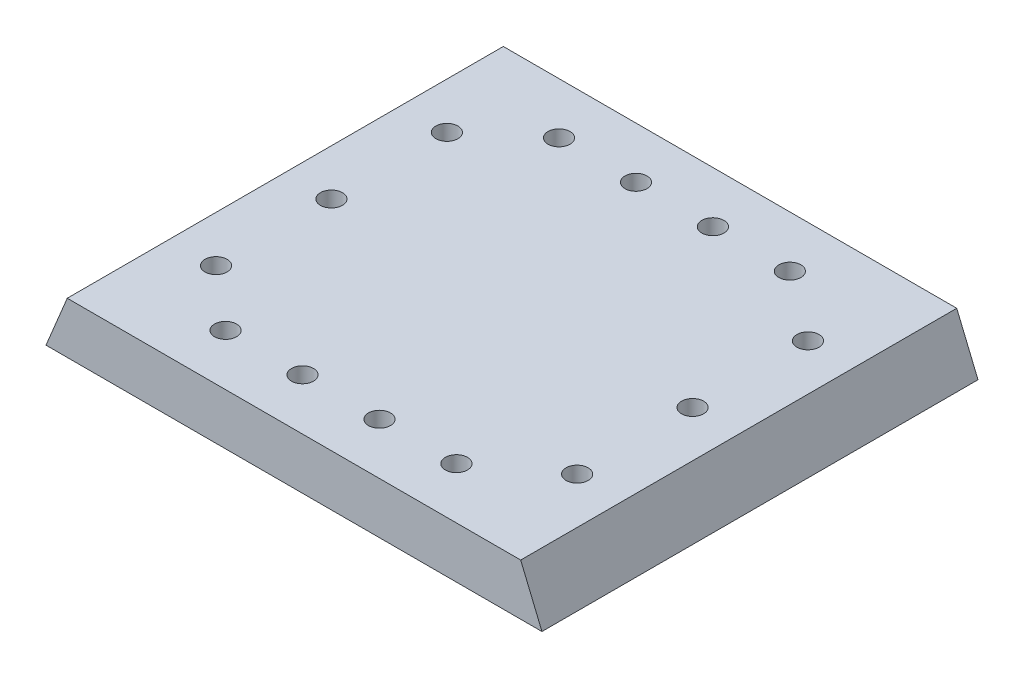
ISO-10303-21;
HEADER;
FILE_DESCRIPTION(('STEP AP214'),'2;1');
FILE_NAME('part.step','',(''),(''),'','','');
FILE_SCHEMA(('AUTOMOTIVE_DESIGN { 1 0 10303 214 1 1 1 1 }'));
ENDSEC;
DATA;
#1=APPLICATION_CONTEXT('core data for automotive mechanical design processes');
#2=APPLICATION_PROTOCOL_DEFINITION('international standard','automotive_design',2000,#1);
#3=PRODUCT_CONTEXT('',#1,'mechanical');
#4=PRODUCT('Part','Part','',(#3));
#5=PRODUCT_RELATED_PRODUCT_CATEGORY('part','',(#4));
#6=PRODUCT_DEFINITION_FORMATION('','',#4);
#7=PRODUCT_DEFINITION_CONTEXT('part definition',#1,'design');
#8=PRODUCT_DEFINITION('design','',#6,#7);
#9=PRODUCT_DEFINITION_SHAPE('','',#8);
#10=(LENGTH_UNIT() NAMED_UNIT(*) SI_UNIT(.MILLI.,.METRE.));
#11=(NAMED_UNIT(*) PLANE_ANGLE_UNIT() SI_UNIT($,.RADIAN.));
#12=(NAMED_UNIT(*) SI_UNIT($,.STERADIAN.) SOLID_ANGLE_UNIT());
#13=UNCERTAINTY_MEASURE_WITH_UNIT(LENGTH_MEASURE(1.E-05),#10,'distance_accuracy_value','');
#14=(GEOMETRIC_REPRESENTATION_CONTEXT(3) GLOBAL_UNCERTAINTY_ASSIGNED_CONTEXT((#13)) GLOBAL_UNIT_ASSIGNED_CONTEXT((#10,
#11,#12)) REPRESENTATION_CONTEXT('',''));
#15=CARTESIAN_POINT('',(0.,0.,0.));
#16=DIRECTION('',(0.,0.,1.));
#17=DIRECTION('',(1.,0.,0.));
#18=AXIS2_PLACEMENT_3D('',#15,#16,#17);
#19=CARTESIAN_POINT('',(70.,85.,9.99999999999999));
#20=DIRECTION('',(0.,-1.,0.));
#21=DIRECTION('',(0.,0.,-1.));
#22=AXIS2_PLACEMENT_3D('',#19,#20,#21);
#23=CYLINDRICAL_SURFACE('',#22,2.15);
#24=CARTESIAN_POINT('',(70.,0.,9.99999999999999));
#25=DIRECTION('',(0.,-1.,0.));
#26=DIRECTION('',(0.,0.,1.));
#27=AXIS2_PLACEMENT_3D('',#24,#25,#26);
#28=CIRCLE('',#27,2.15);
#29=CARTESIAN_POINT('',(70.,0.,12.15));
#30=VERTEX_POINT('',#29);
#31=EDGE_CURVE('E55',#30,#30,#28,.T.);
#32=ORIENTED_EDGE('',*,*,#31,.T.);
#33=EDGE_LOOP('',(#32));
#34=FACE_BOUND('',#33,.T.);
#35=CARTESIAN_POINT('',(70.,9.99999999999999,9.99999999999999));
#36=DIRECTION('',(0.,-1.,0.));
#37=DIRECTION('',(1.,0.,0.));
#38=AXIS2_PLACEMENT_3D('',#35,#36,#37);
#39=CIRCLE('',#38,2.15);
#40=CARTESIAN_POINT('',(72.15,9.99999999999999,9.99999999999999));
#41=VERTEX_POINT('',#40);
#42=EDGE_CURVE('E11',#41,#41,#39,.T.);
#43=ORIENTED_EDGE('',*,*,#42,.F.);
#44=EDGE_LOOP('',(#43));
#45=FACE_BOUND('',#44,.T.);
#46=ADVANCED_FACE('F46',(#34,#45),#23,.F.);
#47=CARTESIAN_POINT('',(55.,85.,9.99999999999999));
#48=DIRECTION('',(0.,-1.,0.));
#49=DIRECTION('',(0.,0.,-1.));
#50=AXIS2_PLACEMENT_3D('',#47,#48,#49);
#51=CYLINDRICAL_SURFACE('',#50,2.15);
#52=CARTESIAN_POINT('',(55.,0.,9.99999999999999));
#53=DIRECTION('',(0.,-1.,0.));
#54=DIRECTION('',(0.,0.,1.));
#55=AXIS2_PLACEMENT_3D('',#52,#53,#54);
#56=CIRCLE('',#55,2.15);
#57=CARTESIAN_POINT('',(55.,0.,12.15));
#58=VERTEX_POINT('',#57);
#59=EDGE_CURVE('E160',#58,#58,#56,.T.);
#60=ORIENTED_EDGE('',*,*,#59,.T.);
#61=EDGE_LOOP('',(#60));
#62=FACE_BOUND('',#61,.T.);
#63=CARTESIAN_POINT('',(55.,9.99999999999999,9.99999999999999));
#64=DIRECTION('',(0.,-1.,0.));
#65=DIRECTION('',(1.,0.,0.));
#66=AXIS2_PLACEMENT_3D('',#63,#64,#65);
#67=CIRCLE('',#66,2.15);
#68=CARTESIAN_POINT('',(57.15,9.99999999999999,9.99999999999999));
#69=VERTEX_POINT('',#68);
#70=EDGE_CURVE('E164',#69,#69,#67,.T.);
#71=ORIENTED_EDGE('',*,*,#70,.F.);
#72=EDGE_LOOP('',(#71));
#73=FACE_BOUND('',#72,.T.);
#74=ADVANCED_FACE('F191',(#62,#73),#51,.F.);
#75=CARTESIAN_POINT('',(70.,85.,75.));
#76=DIRECTION('',(0.,-1.,0.));
#77=DIRECTION('',(0.,0.,-1.));
#78=AXIS2_PLACEMENT_3D('',#75,#76,#77);
#79=CYLINDRICAL_SURFACE('',#78,2.15);
#80=CARTESIAN_POINT('',(70.,0.,75.));
#81=DIRECTION('',(0.,-1.,0.));
#82=DIRECTION('',(0.,0.,-1.));
#83=AXIS2_PLACEMENT_3D('',#80,#81,#82);
#84=CIRCLE('',#83,2.15);
#85=CARTESIAN_POINT('',(70.,0.,72.85));
#86=VERTEX_POINT('',#85);
#87=EDGE_CURVE('E152',#86,#86,#84,.T.);
#88=ORIENTED_EDGE('',*,*,#87,.T.);
#89=EDGE_LOOP('',(#88));
#90=FACE_BOUND('',#89,.T.);
#91=CARTESIAN_POINT('',(70.,9.99999999999999,75.));
#92=DIRECTION('',(0.,-1.,0.));
#93=DIRECTION('',(1.,0.,0.));
#94=AXIS2_PLACEMENT_3D('',#91,#92,#93);
#95=CIRCLE('',#94,2.15);
#96=CARTESIAN_POINT('',(72.15,9.99999999999999,75.));
#97=VERTEX_POINT('',#96);
#98=EDGE_CURVE('E156',#97,#97,#95,.T.);
#99=ORIENTED_EDGE('',*,*,#98,.F.);
#100=EDGE_LOOP('',(#99));
#101=FACE_BOUND('',#100,.T.);
#102=ADVANCED_FACE('F196',(#90,#101),#79,.F.);
#103=CARTESIAN_POINT('',(55.,85.,75.));
#104=DIRECTION('',(0.,-1.,0.));
#105=DIRECTION('',(0.,0.,-1.));
#106=AXIS2_PLACEMENT_3D('',#103,#104,#105);
#107=CYLINDRICAL_SURFACE('',#106,2.15);
#108=CARTESIAN_POINT('',(55.,0.,75.));
#109=DIRECTION('',(0.,-1.,0.));
#110=DIRECTION('',(0.,0.,-1.));
#111=AXIS2_PLACEMENT_3D('',#108,#109,#110);
#112=CIRCLE('',#111,2.15);
#113=CARTESIAN_POINT('',(55.,0.,72.85));
#114=VERTEX_POINT('',#113);
#115=EDGE_CURVE('E136',#114,#114,#112,.T.);
#116=ORIENTED_EDGE('',*,*,#115,.T.);
#117=EDGE_LOOP('',(#116));
#118=FACE_BOUND('',#117,.T.);
#119=CARTESIAN_POINT('',(55.,9.99999999999999,75.));
#120=DIRECTION('',(0.,-1.,0.));
#121=DIRECTION('',(1.,0.,0.));
#122=AXIS2_PLACEMENT_3D('',#119,#120,#121);
#123=CIRCLE('',#122,2.15);
#124=CARTESIAN_POINT('',(57.15,9.99999999999999,75.));
#125=VERTEX_POINT('',#124);
#126=EDGE_CURVE('E148',#125,#125,#123,.T.);
#127=ORIENTED_EDGE('',*,*,#126,.F.);
#128=EDGE_LOOP('',(#127));
#129=FACE_BOUND('',#128,.T.);
#130=ADVANCED_FACE('F185',(#118,#129),#107,.F.);
#131=CARTESIAN_POINT('',(4.14213562373091,9.99999999999999,85.));
#132=DIRECTION('',(0.923879532511288,-0.382683432365087,0.));
#133=DIRECTION('',(0.382683432365087,0.923879532511288,0.));
#134=AXIS2_PLACEMENT_3D('',#131,#132,#133);
#135=PLANE('',#134);
#136=DIRECTION('',(-0.382683432365087,-0.923879532511288,0.));
#137=VECTOR('',#136,1.);
#138=CARTESIAN_POINT('',(4.14213562373091,9.99999999999999,0.));
#139=LINE('',#138,#137);
#140=CARTESIAN_POINT('',(4.14213562373091,9.99999999999999,0.));
#141=VERTEX_POINT('',#140);
#142=CARTESIAN_POINT('',(0.,0.,0.));
#143=VERTEX_POINT('',#142);
#144=EDGE_CURVE('E119',#141,#143,#139,.T.);
#145=ORIENTED_EDGE('',*,*,#144,.T.);
#146=DIRECTION('',(0.,0.,-1.));
#147=VECTOR('',#146,1.);
#148=CARTESIAN_POINT('',(0.,0.,85.));
#149=LINE('',#148,#147);
#150=CARTESIAN_POINT('',(0.,0.,85.));
#151=VERTEX_POINT('',#150);
#152=EDGE_CURVE('E108',#151,#143,#149,.T.);
#153=ORIENTED_EDGE('',*,*,#152,.F.);
#154=DIRECTION('',(-0.382683432365087,-0.923879532511288,0.));
#155=VECTOR('',#154,1.);
#156=CARTESIAN_POINT('',(4.14213562373091,9.99999999999999,85.));
#157=LINE('',#156,#155);
#158=CARTESIAN_POINT('',(4.14213562373091,9.99999999999999,85.));
#159=VERTEX_POINT('',#158);
#160=EDGE_CURVE('E99',#159,#151,#157,.T.);
#161=ORIENTED_EDGE('',*,*,#160,.F.);
#162=DIRECTION('',(0.,0.,-1.));
#163=VECTOR('',#162,1.);
#164=CARTESIAN_POINT('',(4.14213562373091,9.99999999999999,85.));
#165=LINE('',#164,#163);
#166=EDGE_CURVE('E115',#159,#141,#165,.T.);
#167=ORIENTED_EDGE('',*,*,#166,.T.);
#168=EDGE_LOOP('',(#145,#153,#161,#167));
#169=FACE_BOUND('',#168,.T.);
#170=ADVANCED_FACE('F174',(#169),#135,.F.);
#171=CARTESIAN_POINT('',(0.,0.,85.));
#172=DIRECTION('',(0.,1.,0.));
#173=DIRECTION('',(0.,0.,1.));
#174=AXIS2_PLACEMENT_3D('',#171,#172,#173);
#175=PLANE('',#174);
#176=CARTESIAN_POINT('',(13.1421356237309,0.,20.));
#177=DIRECTION('',(0.,1.,0.));
#178=DIRECTION('',(0.,0.,1.));
#179=AXIS2_PLACEMENT_3D('',#176,#177,#178);
#180=CIRCLE('',#179,2.15);
#181=CARTESIAN_POINT('',(13.1421356237309,0.,22.15));
#182=VERTEX_POINT('',#181);
#183=EDGE_CURVE('E301',#182,#182,#180,.T.);
#184=ORIENTED_EDGE('',*,*,#183,.T.);
#185=EDGE_LOOP('',(#184));
#186=FACE_BOUND('',#185,.T.);
#187=CARTESIAN_POINT('',(13.1421356237309,0.,42.5));
#188=DIRECTION('',(0.,1.,0.));
#189=DIRECTION('',(0.,0.,1.));
#190=AXIS2_PLACEMENT_3D('',#187,#188,#189);
#191=CIRCLE('',#190,2.15);
#192=CARTESIAN_POINT('',(13.1421356237309,0.,44.65));
#193=VERTEX_POINT('',#192);
#194=EDGE_CURVE('E297',#193,#193,#191,.T.);
#195=ORIENTED_EDGE('',*,*,#194,.T.);
#196=EDGE_LOOP('',(#195));
#197=FACE_BOUND('',#196,.T.);
#198=CARTESIAN_POINT('',(13.1421356237309,0.,65.));
#199=DIRECTION('',(0.,1.,0.));
#200=DIRECTION('',(0.,0.,1.));
#201=AXIS2_PLACEMENT_3D('',#198,#199,#200);
#202=CIRCLE('',#201,2.15);
#203=CARTESIAN_POINT('',(13.1421356237309,0.,67.15));
#204=VERTEX_POINT('',#203);
#205=EDGE_CURVE('E287',#204,#204,#202,.T.);
#206=ORIENTED_EDGE('',*,*,#205,.T.);
#207=EDGE_LOOP('',(#206));
#208=FACE_BOUND('',#207,.T.);
#209=CARTESIAN_POINT('',(83.5321356237309,0.,65.));
#210=DIRECTION('',(0.,1.,0.));
#211=DIRECTION('',(0.,0.,1.));
#212=AXIS2_PLACEMENT_3D('',#209,#210,#211);
#213=CIRCLE('',#212,2.15);
#214=CARTESIAN_POINT('',(83.5321356237309,0.,67.15));
#215=VERTEX_POINT('',#214);
#216=EDGE_CURVE('E281',#215,#215,#213,.T.);
#217=ORIENTED_EDGE('',*,*,#216,.T.);
#218=EDGE_LOOP('',(#217));
#219=FACE_BOUND('',#218,.T.);
#220=CARTESIAN_POINT('',(83.5321356237309,0.,42.5));
#221=DIRECTION('',(0.,1.,0.));
#222=DIRECTION('',(0.,0.,1.));
#223=AXIS2_PLACEMENT_3D('',#220,#221,#222);
#224=CIRCLE('',#223,2.15);
#225=CARTESIAN_POINT('',(83.5321356237309,0.,44.65));
#226=VERTEX_POINT('',#225);
#227=EDGE_CURVE('E278',#226,#226,#224,.T.);
#228=ORIENTED_EDGE('',*,*,#227,.T.);
#229=EDGE_LOOP('',(#228));
#230=FACE_BOUND('',#229,.T.);
#231=CARTESIAN_POINT('',(83.5321356237309,0.,20.));
#232=DIRECTION('',(0.,1.,0.));
#233=DIRECTION('',(0.,0.,1.));
#234=AXIS2_PLACEMENT_3D('',#231,#232,#233);
#235=CIRCLE('',#234,2.15);
#236=CARTESIAN_POINT('',(83.5321356237309,0.,22.15));
#237=VERTEX_POINT('',#236);
#238=EDGE_CURVE('E282',#237,#237,#235,.T.);
#239=ORIENTED_EDGE('',*,*,#238,.T.);
#240=EDGE_LOOP('',(#239));
#241=FACE_BOUND('',#240,.T.);
#242=CARTESIAN_POINT('',(40.,0.,9.99999999999999));
#243=DIRECTION('',(0.,-1.,0.));
#244=DIRECTION('',(0.,0.,1.));
#245=AXIS2_PLACEMENT_3D('',#242,#243,#244);
#246=CIRCLE('',#245,2.15);
#247=CARTESIAN_POINT('',(40.,0.,12.15));
#248=VERTEX_POINT('',#247);
#249=EDGE_CURVE('E304',#248,#248,#246,.T.);
#250=ORIENTED_EDGE('',*,*,#249,.F.);
#251=EDGE_LOOP('',(#250));
#252=FACE_BOUND('',#251,.T.);
#253=CARTESIAN_POINT('',(40.,0.,75.));
#254=DIRECTION('',(0.,-1.,0.));
#255=DIRECTION('',(0.,0.,-1.));
#256=AXIS2_PLACEMENT_3D('',#253,#254,#255);
#257=CIRCLE('',#256,2.15);
#258=CARTESIAN_POINT('',(40.,0.,72.85));
#259=VERTEX_POINT('',#258);
#260=EDGE_CURVE('E312',#259,#259,#257,.T.);
#261=ORIENTED_EDGE('',*,*,#260,.F.);
#262=EDGE_LOOP('',(#261));
#263=FACE_BOUND('',#262,.T.);
#264=CARTESIAN_POINT('',(25.,0.,75.));
#265=DIRECTION('',(0.,-1.,0.));
#266=DIRECTION('',(0.,0.,-1.));
#267=AXIS2_PLACEMENT_3D('',#264,#265,#266);
#268=CIRCLE('',#267,2.15);
#269=CARTESIAN_POINT('',(25.,0.,72.85));
#270=VERTEX_POINT('',#269);
#271=EDGE_CURVE('E141',#270,#270,#268,.T.);
#272=ORIENTED_EDGE('',*,*,#271,.F.);
#273=EDGE_LOOP('',(#272));
#274=FACE_BOUND('',#273,.T.);
#275=CARTESIAN_POINT('',(25.,0.,9.99999999999999));
#276=DIRECTION('',(0.,-1.,0.));
#277=DIRECTION('',(0.,0.,1.));
#278=AXIS2_PLACEMENT_3D('',#275,#276,#277);
#279=CIRCLE('',#278,2.15);
#280=CARTESIAN_POINT('',(25.,0.,12.15));
#281=VERTEX_POINT('',#280);
#282=EDGE_CURVE('E320',#281,#281,#279,.T.);
#283=ORIENTED_EDGE('',*,*,#282,.F.);
#284=EDGE_LOOP('',(#283));
#285=FACE_BOUND('',#284,.T.);
#286=DIRECTION('',(1.,0.,0.));
#287=VECTOR('',#286,1.);
#288=CARTESIAN_POINT('',(0.,0.,0.));
#289=LINE('',#288,#287);
#290=CARTESIAN_POINT('',(96.6742712474618,0.,0.));
#291=VERTEX_POINT('',#290);
#292=EDGE_CURVE('E106',#143,#291,#289,.T.);
#293=ORIENTED_EDGE('',*,*,#292,.T.);
#294=DIRECTION('',(0.,0.,-1.));
#295=VECTOR('',#294,1.);
#296=CARTESIAN_POINT('',(96.6742712474618,0.,85.));
#297=LINE('',#296,#295);
#298=CARTESIAN_POINT('',(96.6742712474618,0.,85.));
#299=VERTEX_POINT('',#298);
#300=EDGE_CURVE('E103',#299,#291,#297,.T.);
#301=ORIENTED_EDGE('',*,*,#300,.F.);
#302=DIRECTION('',(1.,0.,0.));
#303=VECTOR('',#302,1.);
#304=CARTESIAN_POINT('',(0.,0.,85.));
#305=LINE('',#304,#303);
#306=EDGE_CURVE('E94',#151,#299,#305,.T.);
#307=ORIENTED_EDGE('',*,*,#306,.F.);
#308=ORIENTED_EDGE('',*,*,#152,.T.);
#309=EDGE_LOOP('',(#293,#301,#307,#308));
#310=FACE_BOUND('',#309,.T.);
#311=ORIENTED_EDGE('',*,*,#115,.F.);
#312=EDGE_LOOP('',(#311));
#313=FACE_BOUND('',#312,.T.);
#314=ORIENTED_EDGE('',*,*,#87,.F.);
#315=EDGE_LOOP('',(#314));
#316=FACE_BOUND('',#315,.T.);
#317=ORIENTED_EDGE('',*,*,#59,.F.);
#318=EDGE_LOOP('',(#317));
#319=FACE_BOUND('',#318,.T.);
#320=ORIENTED_EDGE('',*,*,#31,.F.);
#321=EDGE_LOOP('',(#320));
#322=FACE_BOUND('',#321,.T.);
#323=ADVANCED_FACE('F104',(#186,#197,#208,#219,#230,#241,#252,#263,#274,#285,#310,#313,#316,
#319,#322),#175,.F.);
#324=CARTESIAN_POINT('',(96.6742712474618,0.,85.));
#325=DIRECTION('',(-0.923879532511287,-0.382683432365089,0.));
#326=DIRECTION('',(0.382683432365089,-0.923879532511287,0.));
#327=AXIS2_PLACEMENT_3D('',#324,#325,#326);
#328=PLANE('',#327);
#329=DIRECTION('',(-0.382683432365089,0.923879532511287,0.));
#330=VECTOR('',#329,1.);
#331=CARTESIAN_POINT('',(96.6742712474618,0.,0.));
#332=LINE('',#331,#330);
#333=CARTESIAN_POINT('',(92.5321356237309,9.99999999999999,0.));
#334=VERTEX_POINT('',#333);
#335=EDGE_CURVE('E80',#291,#334,#332,.T.);
#336=ORIENTED_EDGE('',*,*,#335,.T.);
#337=DIRECTION('',(0.,0.,-1.));
#338=VECTOR('',#337,1.);
#339=CARTESIAN_POINT('',(92.5321356237309,9.99999999999999,85.));
#340=LINE('',#339,#338);
#341=CARTESIAN_POINT('',(92.5321356237309,9.99999999999999,85.));
#342=VERTEX_POINT('',#341);
#343=EDGE_CURVE('E109',#342,#334,#340,.T.);
#344=ORIENTED_EDGE('',*,*,#343,.F.);
#345=DIRECTION('',(-0.382683432365089,0.923879532511287,0.));
#346=VECTOR('',#345,1.);
#347=CARTESIAN_POINT('',(96.6742712474618,0.,85.));
#348=LINE('',#347,#346);
#349=EDGE_CURVE('E97',#299,#342,#348,.T.);
#350=ORIENTED_EDGE('',*,*,#349,.F.);
#351=ORIENTED_EDGE('',*,*,#300,.T.);
#352=EDGE_LOOP('',(#336,#344,#350,#351));
#353=FACE_BOUND('',#352,.T.);
#354=ADVANCED_FACE('F111',(#353),#328,.F.);
#355=CARTESIAN_POINT('',(92.5321356237309,9.99999999999999,85.));
#356=DIRECTION('',(0.,-1.,0.));
#357=DIRECTION('',(1.,0.,0.));
#358=AXIS2_PLACEMENT_3D('',#355,#356,#357);
#359=PLANE('',#358);
#360=CARTESIAN_POINT('',(13.1421356237309,9.99999999999999,20.));
#361=DIRECTION('',(0.,1.,0.));
#362=DIRECTION('',(1.,0.,0.));
#363=AXIS2_PLACEMENT_3D('',#360,#361,#362);
#364=CIRCLE('',#363,2.15);
#365=CARTESIAN_POINT('',(15.2921356237309,9.99999999999999,20.));
#366=VERTEX_POINT('',#365);
#367=EDGE_CURVE('E363',#366,#366,#364,.T.);
#368=ORIENTED_EDGE('',*,*,#367,.F.);
#369=EDGE_LOOP('',(#368));
#370=FACE_BOUND('',#369,.T.);
#371=CARTESIAN_POINT('',(13.1421356237309,9.99999999999999,42.5));
#372=DIRECTION('',(0.,1.,0.));
#373=DIRECTION('',(1.,0.,0.));
#374=AXIS2_PLACEMENT_3D('',#371,#372,#373);
#375=CIRCLE('',#374,2.15);
#376=CARTESIAN_POINT('',(15.2921356237309,9.99999999999999,42.5));
#377=VERTEX_POINT('',#376);
#378=EDGE_CURVE('E367',#377,#377,#375,.T.);
#379=ORIENTED_EDGE('',*,*,#378,.F.);
#380=EDGE_LOOP('',(#379));
#381=FACE_BOUND('',#380,.T.);
#382=CARTESIAN_POINT('',(13.1421356237309,9.99999999999999,65.));
#383=DIRECTION('',(0.,1.,0.));
#384=DIRECTION('',(1.,0.,0.));
#385=AXIS2_PLACEMENT_3D('',#382,#383,#384);
#386=CIRCLE('',#385,2.15);
#387=CARTESIAN_POINT('',(15.2921356237309,9.99999999999999,65.));
#388=VERTEX_POINT('',#387);
#389=EDGE_CURVE('E371',#388,#388,#386,.T.);
#390=ORIENTED_EDGE('',*,*,#389,.F.);
#391=EDGE_LOOP('',(#390));
#392=FACE_BOUND('',#391,.T.);
#393=CARTESIAN_POINT('',(83.5321356237309,9.99999999999999,65.));
#394=DIRECTION('',(0.,1.,0.));
#395=DIRECTION('',(-1.,0.,0.));
#396=AXIS2_PLACEMENT_3D('',#393,#394,#395);
#397=CIRCLE('',#396,2.15);
#398=CARTESIAN_POINT('',(81.3821356237309,9.99999999999999,65.));
#399=VERTEX_POINT('',#398);
#400=EDGE_CURVE('E375',#399,#399,#397,.T.);
#401=ORIENTED_EDGE('',*,*,#400,.F.);
#402=EDGE_LOOP('',(#401));
#403=FACE_BOUND('',#402,.T.);
#404=CARTESIAN_POINT('',(83.5321356237309,9.99999999999999,42.5));
#405=DIRECTION('',(0.,1.,0.));
#406=DIRECTION('',(-1.,0.,0.));
#407=AXIS2_PLACEMENT_3D('',#404,#405,#406);
#408=CIRCLE('',#407,2.15);
#409=CARTESIAN_POINT('',(81.3821356237309,9.99999999999999,42.5));
#410=VERTEX_POINT('',#409);
#411=EDGE_CURVE('E275',#410,#410,#408,.T.);
#412=ORIENTED_EDGE('',*,*,#411,.F.);
#413=EDGE_LOOP('',(#412));
#414=FACE_BOUND('',#413,.T.);
#415=CARTESIAN_POINT('',(83.5321356237309,9.99999999999999,20.));
#416=DIRECTION('',(0.,1.,0.));
#417=DIRECTION('',(-1.,0.,0.));
#418=AXIS2_PLACEMENT_3D('',#415,#416,#417);
#419=CIRCLE('',#418,2.15);
#420=CARTESIAN_POINT('',(81.3821356237309,9.99999999999999,20.));
#421=VERTEX_POINT('',#420);
#422=EDGE_CURVE('E290',#421,#421,#419,.T.);
#423=ORIENTED_EDGE('',*,*,#422,.F.);
#424=EDGE_LOOP('',(#423));
#425=FACE_BOUND('',#424,.T.);
#426=CARTESIAN_POINT('',(40.,9.99999999999999,9.99999999999999));
#427=DIRECTION('',(0.,-1.,0.));
#428=DIRECTION('',(1.,0.,0.));
#429=AXIS2_PLACEMENT_3D('',#426,#427,#428);
#430=CIRCLE('',#429,2.15);
#431=CARTESIAN_POINT('',(42.15,9.99999999999999,9.99999999999999));
#432=VERTEX_POINT('',#431);
#433=EDGE_CURVE('E308',#432,#432,#430,.T.);
#434=ORIENTED_EDGE('',*,*,#433,.T.);
#435=EDGE_LOOP('',(#434));
#436=FACE_BOUND('',#435,.T.);
#437=CARTESIAN_POINT('',(40.,9.99999999999999,75.));
#438=DIRECTION('',(0.,-1.,0.));
#439=DIRECTION('',(1.,0.,0.));
#440=AXIS2_PLACEMENT_3D('',#437,#438,#439);
#441=CIRCLE('',#440,2.15);
#442=CARTESIAN_POINT('',(42.15,9.99999999999999,75.));
#443=VERTEX_POINT('',#442);
#444=EDGE_CURVE('E316',#443,#443,#441,.T.);
#445=ORIENTED_EDGE('',*,*,#444,.T.);
#446=EDGE_LOOP('',(#445));
#447=FACE_BOUND('',#446,.T.);
#448=CARTESIAN_POINT('',(25.,9.99999999999999,75.));
#449=DIRECTION('',(0.,-1.,0.));
#450=DIRECTION('',(1.,0.,0.));
#451=AXIS2_PLACEMENT_3D('',#448,#449,#450);
#452=CIRCLE('',#451,2.15);
#453=CARTESIAN_POINT('',(27.15,9.99999999999999,75.));
#454=VERTEX_POINT('',#453);
#455=EDGE_CURVE('E123',#454,#454,#452,.T.);
#456=ORIENTED_EDGE('',*,*,#455,.T.);
#457=EDGE_LOOP('',(#456));
#458=FACE_BOUND('',#457,.T.);
#459=CARTESIAN_POINT('',(25.,9.99999999999999,9.99999999999999));
#460=DIRECTION('',(0.,-1.,0.));
#461=DIRECTION('',(1.,0.,0.));
#462=AXIS2_PLACEMENT_3D('',#459,#460,#461);
#463=CIRCLE('',#462,2.15);
#464=CARTESIAN_POINT('',(27.15,9.99999999999999,9.99999999999999));
#465=VERTEX_POINT('',#464);
#466=EDGE_CURVE('E137',#465,#465,#463,.T.);
#467=ORIENTED_EDGE('',*,*,#466,.T.);
#468=EDGE_LOOP('',(#467));
#469=FACE_BOUND('',#468,.T.);
#470=DIRECTION('',(-1.,0.,0.));
#471=VECTOR('',#470,1.);
#472=CARTESIAN_POINT('',(92.5321356237309,9.99999999999999,0.));
#473=LINE('',#472,#471);
#474=EDGE_CURVE('E86',#334,#141,#473,.T.);
#475=ORIENTED_EDGE('',*,*,#474,.T.);
#476=ORIENTED_EDGE('',*,*,#166,.F.);
#477=DIRECTION('',(-1.,0.,0.));
#478=VECTOR('',#477,1.);
#479=CARTESIAN_POINT('',(92.5321356237309,9.99999999999999,85.));
#480=LINE('',#479,#478);
#481=EDGE_CURVE('E63',#342,#159,#480,.T.);
#482=ORIENTED_EDGE('',*,*,#481,.F.);
#483=ORIENTED_EDGE('',*,*,#343,.T.);
#484=EDGE_LOOP('',(#475,#476,#482,#483));
#485=FACE_BOUND('',#484,.T.);
#486=ORIENTED_EDGE('',*,*,#126,.T.);
#487=EDGE_LOOP('',(#486));
#488=FACE_BOUND('',#487,.T.);
#489=ORIENTED_EDGE('',*,*,#98,.T.);
#490=EDGE_LOOP('',(#489));
#491=FACE_BOUND('',#490,.T.);
#492=ORIENTED_EDGE('',*,*,#70,.T.);
#493=EDGE_LOOP('',(#492));
#494=FACE_BOUND('',#493,.T.);
#495=ORIENTED_EDGE('',*,*,#42,.T.);
#496=EDGE_LOOP('',(#495));
#497=FACE_BOUND('',#496,.T.);
#498=ADVANCED_FACE('F182',(#370,#381,#392,#403,#414,#425,#436,#447,#458,#469,#485,#488,#491,
#494,#497),#359,.F.);
#499=CARTESIAN_POINT('',(0.,0.,85.));
#500=DIRECTION('',(0.,0.,1.));
#501=DIRECTION('',(1.,0.,0.));
#502=AXIS2_PLACEMENT_3D('',#499,#500,#501);
#503=PLANE('',#502);
#504=ORIENTED_EDGE('',*,*,#160,.T.);
#505=ORIENTED_EDGE('',*,*,#306,.T.);
#506=ORIENTED_EDGE('',*,*,#349,.T.);
#507=ORIENTED_EDGE('',*,*,#481,.T.);
#508=EDGE_LOOP('',(#504,#505,#506,#507));
#509=FACE_BOUND('',#508,.T.);
#510=ADVANCED_FACE('F95',(#509),#503,.T.);
#511=CARTESIAN_POINT('',(0.,0.,0.));
#512=DIRECTION('',(0.,0.,1.));
#513=DIRECTION('',(1.,0.,0.));
#514=AXIS2_PLACEMENT_3D('',#511,#512,#513);
#515=PLANE('',#514);
#516=ORIENTED_EDGE('',*,*,#144,.F.);
#517=ORIENTED_EDGE('',*,*,#474,.F.);
#518=ORIENTED_EDGE('',*,*,#335,.F.);
#519=ORIENTED_EDGE('',*,*,#292,.F.);
#520=EDGE_LOOP('',(#516,#517,#518,#519));
#521=FACE_BOUND('',#520,.T.);
#522=ADVANCED_FACE('F227',(#521),#515,.F.);
#523=CARTESIAN_POINT('',(25.,85.,9.99999999999999));
#524=DIRECTION('',(0.,-1.,0.));
#525=DIRECTION('',(0.,0.,-1.));
#526=AXIS2_PLACEMENT_3D('',#523,#524,#525);
#527=CYLINDRICAL_SURFACE('',#526,2.15);
#528=ORIENTED_EDGE('',*,*,#282,.T.);
#529=EDGE_LOOP('',(#528));
#530=FACE_BOUND('',#529,.T.);
#531=ORIENTED_EDGE('',*,*,#466,.F.);
#532=EDGE_LOOP('',(#531));
#533=FACE_BOUND('',#532,.T.);
#534=ADVANCED_FACE('F233',(#530,#533),#527,.F.);
#535=CARTESIAN_POINT('',(25.,85.,75.));
#536=DIRECTION('',(0.,-1.,0.));
#537=DIRECTION('',(0.,0.,-1.));
#538=AXIS2_PLACEMENT_3D('',#535,#536,#537);
#539=CYLINDRICAL_SURFACE('',#538,2.15);
#540=ORIENTED_EDGE('',*,*,#271,.T.);
#541=EDGE_LOOP('',(#540));
#542=FACE_BOUND('',#541,.T.);
#543=ORIENTED_EDGE('',*,*,#455,.F.);
#544=EDGE_LOOP('',(#543));
#545=FACE_BOUND('',#544,.T.);
#546=ADVANCED_FACE('F238',(#542,#545),#539,.F.);
#547=CARTESIAN_POINT('',(40.,85.,75.));
#548=DIRECTION('',(0.,-1.,0.));
#549=DIRECTION('',(0.,0.,-1.));
#550=AXIS2_PLACEMENT_3D('',#547,#548,#549);
#551=CYLINDRICAL_SURFACE('',#550,2.15);
#552=ORIENTED_EDGE('',*,*,#260,.T.);
#553=EDGE_LOOP('',(#552));
#554=FACE_BOUND('',#553,.T.);
#555=ORIENTED_EDGE('',*,*,#444,.F.);
#556=EDGE_LOOP('',(#555));
#557=FACE_BOUND('',#556,.T.);
#558=ADVANCED_FACE('F241',(#554,#557),#551,.F.);
#559=CARTESIAN_POINT('',(40.,85.,9.99999999999999));
#560=DIRECTION('',(0.,-1.,0.));
#561=DIRECTION('',(0.,0.,-1.));
#562=AXIS2_PLACEMENT_3D('',#559,#560,#561);
#563=CYLINDRICAL_SURFACE('',#562,2.15);
#564=ORIENTED_EDGE('',*,*,#249,.T.);
#565=EDGE_LOOP('',(#564));
#566=FACE_BOUND('',#565,.T.);
#567=ORIENTED_EDGE('',*,*,#433,.F.);
#568=EDGE_LOOP('',(#567));
#569=FACE_BOUND('',#568,.T.);
#570=ADVANCED_FACE('F244',(#566,#569),#563,.F.);
#571=CARTESIAN_POINT('',(83.5321356237309,-75.,20.));
#572=DIRECTION('',(0.,1.,0.));
#573=DIRECTION('',(-1.,0.,0.));
#574=AXIS2_PLACEMENT_3D('',#571,#572,#573);
#575=CYLINDRICAL_SURFACE('',#574,2.15);
#576=ORIENTED_EDGE('',*,*,#422,.T.);
#577=EDGE_LOOP('',(#576));
#578=FACE_BOUND('',#577,.T.);
#579=ORIENTED_EDGE('',*,*,#238,.F.);
#580=EDGE_LOOP('',(#579));
#581=FACE_BOUND('',#580,.T.);
#582=ADVANCED_FACE('F247',(#578,#581),#575,.F.);
#583=CARTESIAN_POINT('',(83.5321356237309,-75.,42.5));
#584=DIRECTION('',(0.,1.,0.));
#585=DIRECTION('',(-1.,0.,0.));
#586=AXIS2_PLACEMENT_3D('',#583,#584,#585);
#587=CYLINDRICAL_SURFACE('',#586,2.15);
#588=ORIENTED_EDGE('',*,*,#411,.T.);
#589=EDGE_LOOP('',(#588));
#590=FACE_BOUND('',#589,.T.);
#591=ORIENTED_EDGE('',*,*,#227,.F.);
#592=EDGE_LOOP('',(#591));
#593=FACE_BOUND('',#592,.T.);
#594=ADVANCED_FACE('F250',(#590,#593),#587,.F.);
#595=CARTESIAN_POINT('',(83.5321356237309,-75.,65.));
#596=DIRECTION('',(0.,1.,0.));
#597=DIRECTION('',(-1.,0.,0.));
#598=AXIS2_PLACEMENT_3D('',#595,#596,#597);
#599=CYLINDRICAL_SURFACE('',#598,2.15);
#600=ORIENTED_EDGE('',*,*,#400,.T.);
#601=EDGE_LOOP('',(#600));
#602=FACE_BOUND('',#601,.T.);
#603=ORIENTED_EDGE('',*,*,#216,.F.);
#604=EDGE_LOOP('',(#603));
#605=FACE_BOUND('',#604,.T.);
#606=ADVANCED_FACE('F263',(#602,#605),#599,.F.);
#607=CARTESIAN_POINT('',(13.1421356237309,-75.,65.));
#608=DIRECTION('',(0.,1.,0.));
#609=DIRECTION('',(-1.,0.,0.));
#610=AXIS2_PLACEMENT_3D('',#607,#608,#609);
#611=CYLINDRICAL_SURFACE('',#610,2.15);
#612=ORIENTED_EDGE('',*,*,#389,.T.);
#613=EDGE_LOOP('',(#612));
#614=FACE_BOUND('',#613,.T.);
#615=ORIENTED_EDGE('',*,*,#205,.F.);
#616=EDGE_LOOP('',(#615));
#617=FACE_BOUND('',#616,.T.);
#618=ADVANCED_FACE('F259',(#614,#617),#611,.F.);
#619=CARTESIAN_POINT('',(13.1421356237309,-75.,42.5));
#620=DIRECTION('',(0.,1.,0.));
#621=DIRECTION('',(-1.,0.,0.));
#622=AXIS2_PLACEMENT_3D('',#619,#620,#621);
#623=CYLINDRICAL_SURFACE('',#622,2.15);
#624=ORIENTED_EDGE('',*,*,#378,.T.);
#625=EDGE_LOOP('',(#624));
#626=FACE_BOUND('',#625,.T.);
#627=ORIENTED_EDGE('',*,*,#194,.F.);
#628=EDGE_LOOP('',(#627));
#629=FACE_BOUND('',#628,.T.);
#630=ADVANCED_FACE('F255',(#626,#629),#623,.F.);
#631=CARTESIAN_POINT('',(13.1421356237309,-75.,20.));
#632=DIRECTION('',(0.,1.,0.));
#633=DIRECTION('',(-1.,0.,0.));
#634=AXIS2_PLACEMENT_3D('',#631,#632,#633);
#635=CYLINDRICAL_SURFACE('',#634,2.15);
#636=ORIENTED_EDGE('',*,*,#367,.T.);
#637=EDGE_LOOP('',(#636));
#638=FACE_BOUND('',#637,.T.);
#639=ORIENTED_EDGE('',*,*,#183,.F.);
#640=EDGE_LOOP('',(#639));
#641=FACE_BOUND('',#640,.T.);
#642=ADVANCED_FACE('F252',(#638,#641),#635,.F.);
#643=CLOSED_SHELL('',(#46,#74,#102,#130,#170,#323,#354,#498,#510,#522,#534,#546,#558,#570,#582,
#594,#606,#618,#630,#642));
#644=MANIFOLD_SOLID_BREP('B2',#643);
#645=ADVANCED_BREP_SHAPE_REPRESENTATION('',(#18,#644),#14);
#646=SHAPE_DEFINITION_REPRESENTATION(#9,#645);
ENDSEC;
END-ISO-10303-21;
